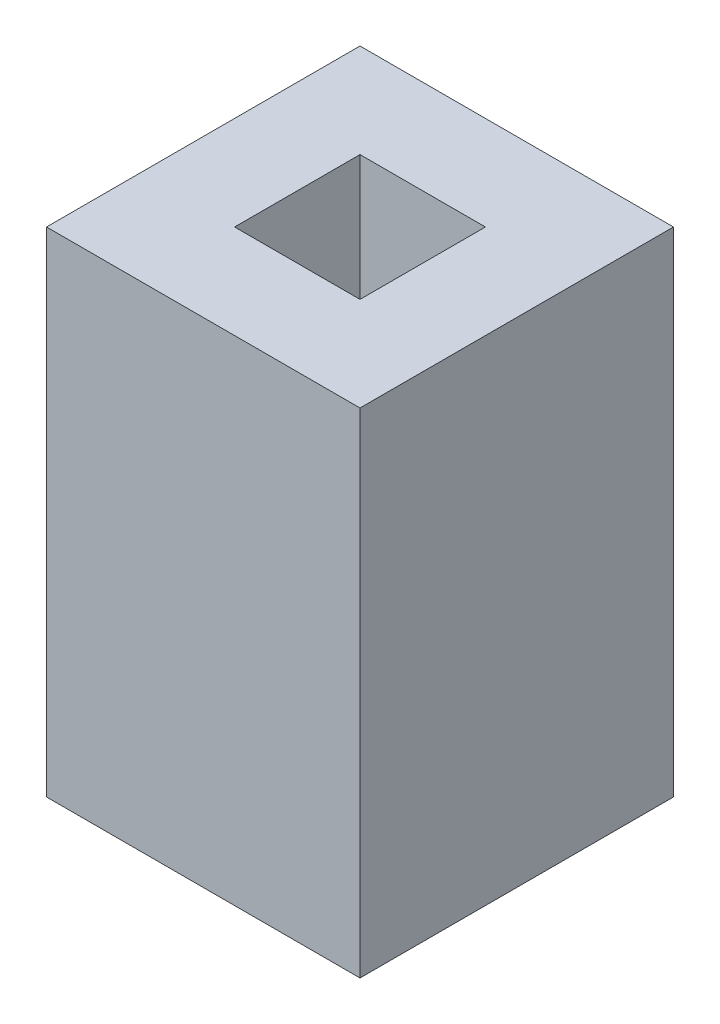
ISO-10303-21;
HEADER;
FILE_DESCRIPTION(('STEP AP214'),'2;1');
FILE_NAME('part.step','',(''),(''),'','','');
FILE_SCHEMA(('AUTOMOTIVE_DESIGN { 1 0 10303 214 1 1 1 1 }'));
ENDSEC;
DATA;
#1=APPLICATION_CONTEXT('core data for automotive mechanical design processes');
#2=APPLICATION_PROTOCOL_DEFINITION('international standard','automotive_design',2000,#1);
#3=PRODUCT_CONTEXT('',#1,'mechanical');
#4=PRODUCT('Part','Part','',(#3));
#5=PRODUCT_RELATED_PRODUCT_CATEGORY('part','',(#4));
#6=PRODUCT_DEFINITION_FORMATION('','',#4);
#7=PRODUCT_DEFINITION_CONTEXT('part definition',#1,'design');
#8=PRODUCT_DEFINITION('design','',#6,#7);
#9=PRODUCT_DEFINITION_SHAPE('','',#8);
#10=(LENGTH_UNIT() NAMED_UNIT(*) SI_UNIT(.MILLI.,.METRE.));
#11=(NAMED_UNIT(*) PLANE_ANGLE_UNIT() SI_UNIT($,.RADIAN.));
#12=(NAMED_UNIT(*) SI_UNIT($,.STERADIAN.) SOLID_ANGLE_UNIT());
#13=UNCERTAINTY_MEASURE_WITH_UNIT(LENGTH_MEASURE(1.E-05),#10,'distance_accuracy_value','');
#14=(GEOMETRIC_REPRESENTATION_CONTEXT(3) GLOBAL_UNCERTAINTY_ASSIGNED_CONTEXT((#13)) GLOBAL_UNIT_ASSIGNED_CONTEXT((#10,
#11,#12)) REPRESENTATION_CONTEXT('',''));
#15=CARTESIAN_POINT('',(0.,0.,0.));
#16=DIRECTION('',(0.,0.,1.));
#17=DIRECTION('',(1.,0.,0.));
#18=AXIS2_PLACEMENT_3D('',#15,#16,#17);
#19=CARTESIAN_POINT('',(-8.38199999999997,2.4,-8.25499999999999));
#20=DIRECTION('',(1.,0.,0.));
#21=DIRECTION('',(0.,0.,-1.));
#22=AXIS2_PLACEMENT_3D('',#19,#20,#21);
#23=PLANE('',#22);
#24=DIRECTION('',(0.,0.,-1.));
#25=VECTOR('',#24,1.);
#26=CARTESIAN_POINT('',(-8.38199999999997,4.4,-8.25499999999999));
#27=LINE('',#26,#25);
#28=CARTESIAN_POINT('',(-8.38199999999997,4.4,-8.25499999999999));
#29=VERTEX_POINT('',#28);
#30=CARTESIAN_POINT('',(-8.38199999999997,4.4,-9.525));
#31=VERTEX_POINT('',#30);
#32=EDGE_CURVE('E11',#29,#31,#27,.T.);
#33=ORIENTED_EDGE('',*,*,#32,.F.);
#34=DIRECTION('',(0.,1.,0.));
#35=VECTOR('',#34,1.);
#36=CARTESIAN_POINT('',(-8.38199999999997,2.4,-8.25499999999999));
#37=LINE('',#36,#35);
#38=CARTESIAN_POINT('',(-8.38199999999997,2.4,-8.25499999999999));
#39=VERTEX_POINT('',#38);
#40=EDGE_CURVE('E24',#39,#29,#37,.T.);
#41=ORIENTED_EDGE('',*,*,#40,.F.);
#42=DIRECTION('',(0.,0.,-1.));
#43=VECTOR('',#42,1.);
#44=CARTESIAN_POINT('',(-8.38199999999997,2.4,-8.25499999999999));
#45=LINE('',#44,#43);
#46=CARTESIAN_POINT('',(-8.38199999999997,2.4,-9.525));
#47=VERTEX_POINT('',#46);
#48=EDGE_CURVE('E144',#39,#47,#45,.T.);
#49=ORIENTED_EDGE('',*,*,#48,.T.);
#50=DIRECTION('',(0.,1.,0.));
#51=VECTOR('',#50,1.);
#52=CARTESIAN_POINT('',(-8.38199999999997,2.4,-9.525));
#53=LINE('',#52,#51);
#54=EDGE_CURVE('E142',#47,#31,#53,.T.);
#55=ORIENTED_EDGE('',*,*,#54,.T.);
#56=EDGE_LOOP('',(#33,#41,#49,#55));
#57=FACE_BOUND('',#56,.T.);
#58=ADVANCED_FACE('F17',(#57),#23,.T.);
#59=CARTESIAN_POINT('',(-9.652,2.4,-8.25499999999999));
#60=DIRECTION('',(0.,0.,1.));
#61=DIRECTION('',(1.,0.,0.));
#62=AXIS2_PLACEMENT_3D('',#59,#60,#61);
#63=PLANE('',#62);
#64=DIRECTION('',(1.,0.,0.));
#65=VECTOR('',#64,1.);
#66=CARTESIAN_POINT('',(-9.652,4.4,-8.25499999999999));
#67=LINE('',#66,#65);
#68=CARTESIAN_POINT('',(-9.652,4.4,-8.25499999999999));
#69=VERTEX_POINT('',#68);
#70=EDGE_CURVE('E140',#69,#29,#67,.T.);
#71=ORIENTED_EDGE('',*,*,#70,.F.);
#72=DIRECTION('',(0.,1.,0.));
#73=VECTOR('',#72,1.);
#74=CARTESIAN_POINT('',(-9.652,2.4,-8.25499999999999));
#75=LINE('',#74,#73);
#76=CARTESIAN_POINT('',(-9.652,2.4,-8.25499999999999));
#77=VERTEX_POINT('',#76);
#78=EDGE_CURVE('E137',#77,#69,#75,.T.);
#79=ORIENTED_EDGE('',*,*,#78,.F.);
#80=DIRECTION('',(1.,0.,0.));
#81=VECTOR('',#80,1.);
#82=CARTESIAN_POINT('',(-9.652,2.4,-8.25499999999999));
#83=LINE('',#82,#81);
#84=EDGE_CURVE('E134',#77,#39,#83,.T.);
#85=ORIENTED_EDGE('',*,*,#84,.T.);
#86=ORIENTED_EDGE('',*,*,#40,.T.);
#87=EDGE_LOOP('',(#71,#79,#85,#86));
#88=FACE_BOUND('',#87,.T.);
#89=ADVANCED_FACE('F146',(#88),#63,.T.);
#90=CARTESIAN_POINT('',(-9.652,2.4,-9.525));
#91=DIRECTION('',(-1.,0.,0.));
#92=DIRECTION('',(0.,0.,1.));
#93=AXIS2_PLACEMENT_3D('',#90,#91,#92);
#94=PLANE('',#93);
#95=DIRECTION('',(0.,0.,1.));
#96=VECTOR('',#95,1.);
#97=CARTESIAN_POINT('',(-9.652,4.4,-9.525));
#98=LINE('',#97,#96);
#99=CARTESIAN_POINT('',(-9.652,4.4,-9.525));
#100=VERTEX_POINT('',#99);
#101=EDGE_CURVE('E131',#100,#69,#98,.T.);
#102=ORIENTED_EDGE('',*,*,#101,.F.);
#103=DIRECTION('',(0.,1.,0.));
#104=VECTOR('',#103,1.);
#105=CARTESIAN_POINT('',(-9.652,2.4,-9.525));
#106=LINE('',#105,#104);
#107=CARTESIAN_POINT('',(-9.652,2.4,-9.525));
#108=VERTEX_POINT('',#107);
#109=EDGE_CURVE('E128',#108,#100,#106,.T.);
#110=ORIENTED_EDGE('',*,*,#109,.F.);
#111=DIRECTION('',(0.,0.,1.));
#112=VECTOR('',#111,1.);
#113=CARTESIAN_POINT('',(-9.652,2.4,-9.525));
#114=LINE('',#113,#112);
#115=EDGE_CURVE('E125',#108,#77,#114,.T.);
#116=ORIENTED_EDGE('',*,*,#115,.T.);
#117=ORIENTED_EDGE('',*,*,#78,.T.);
#118=EDGE_LOOP('',(#102,#110,#116,#117));
#119=FACE_BOUND('',#118,.T.);
#120=ADVANCED_FACE('F151',(#119),#94,.T.);
#121=CARTESIAN_POINT('',(-8.38199999999997,2.4,-9.525));
#122=DIRECTION('',(0.,0.,-1.));
#123=DIRECTION('',(-1.,0.,0.));
#124=AXIS2_PLACEMENT_3D('',#121,#122,#123);
#125=PLANE('',#124);
#126=DIRECTION('',(-1.,0.,0.));
#127=VECTOR('',#126,1.);
#128=CARTESIAN_POINT('',(-8.38199999999997,4.4,-9.525));
#129=LINE('',#128,#127);
#130=EDGE_CURVE('E123',#31,#100,#129,.T.);
#131=ORIENTED_EDGE('',*,*,#130,.F.);
#132=ORIENTED_EDGE('',*,*,#54,.F.);
#133=DIRECTION('',(-1.,0.,0.));
#134=VECTOR('',#133,1.);
#135=CARTESIAN_POINT('',(-8.38199999999997,2.4,-9.525));
#136=LINE('',#135,#134);
#137=EDGE_CURVE('E120',#47,#108,#136,.T.);
#138=ORIENTED_EDGE('',*,*,#137,.T.);
#139=ORIENTED_EDGE('',*,*,#109,.T.);
#140=EDGE_LOOP('',(#131,#132,#138,#139));
#141=FACE_BOUND('',#140,.T.);
#142=ADVANCED_FACE('F154',(#141),#125,.T.);
#143=CARTESIAN_POINT('',(0.,2.4,0.));
#144=DIRECTION('',(0.,1.,0.));
#145=DIRECTION('',(0.,0.,1.));
#146=AXIS2_PLACEMENT_3D('',#143,#144,#145);
#147=PLANE('',#146);
#148=DIRECTION('',(-1.,0.,0.));
#149=VECTOR('',#148,1.);
#150=CARTESIAN_POINT('',(-8.763,2.4,-9.144));
#151=LINE('',#150,#149);
#152=CARTESIAN_POINT('',(-8.763,2.4,-9.144));
#153=VERTEX_POINT('',#152);
#154=CARTESIAN_POINT('',(-9.271,2.4,-9.144));
#155=VERTEX_POINT('',#154);
#156=EDGE_CURVE('E118',#153,#155,#151,.T.);
#157=ORIENTED_EDGE('',*,*,#156,.T.);
#158=DIRECTION('',(0.,0.,1.));
#159=VECTOR('',#158,1.);
#160=CARTESIAN_POINT('',(-9.271,2.4,-9.144));
#161=LINE('',#160,#159);
#162=CARTESIAN_POINT('',(-9.271,2.4,-8.636));
#163=VERTEX_POINT('',#162);
#164=EDGE_CURVE('E116',#155,#163,#161,.T.);
#165=ORIENTED_EDGE('',*,*,#164,.T.);
#166=DIRECTION('',(1.,0.,0.));
#167=VECTOR('',#166,1.);
#168=CARTESIAN_POINT('',(-9.271,2.4,-8.636));
#169=LINE('',#168,#167);
#170=CARTESIAN_POINT('',(-8.763,2.4,-8.636));
#171=VERTEX_POINT('',#170);
#172=EDGE_CURVE('E114',#163,#171,#169,.T.);
#173=ORIENTED_EDGE('',*,*,#172,.T.);
#174=DIRECTION('',(0.,0.,-1.));
#175=VECTOR('',#174,1.);
#176=CARTESIAN_POINT('',(-8.763,2.4,-8.636));
#177=LINE('',#176,#175);
#178=EDGE_CURVE('E101',#171,#153,#177,.T.);
#179=ORIENTED_EDGE('',*,*,#178,.T.);
#180=EDGE_LOOP('',(#157,#165,#173,#179));
#181=FACE_BOUND('',#180,.T.);
#182=ORIENTED_EDGE('',*,*,#48,.F.);
#183=ORIENTED_EDGE('',*,*,#84,.F.);
#184=ORIENTED_EDGE('',*,*,#115,.F.);
#185=ORIENTED_EDGE('',*,*,#137,.F.);
#186=EDGE_LOOP('',(#182,#183,#184,#185));
#187=FACE_BOUND('',#186,.T.);
#188=ADVANCED_FACE('F158',(#181,#187),#147,.F.);
#189=CARTESIAN_POINT('',(0.,4.4,0.));
#190=DIRECTION('',(0.,1.,0.));
#191=DIRECTION('',(0.,0.,1.));
#192=AXIS2_PLACEMENT_3D('',#189,#190,#191);
#193=PLANE('',#192);
#194=DIRECTION('',(0.,0.,1.));
#195=VECTOR('',#194,1.);
#196=CARTESIAN_POINT('',(-9.271,4.4,-9.144));
#197=LINE('',#196,#195);
#198=CARTESIAN_POINT('',(-9.271,4.4,-9.144));
#199=VERTEX_POINT('',#198);
#200=CARTESIAN_POINT('',(-9.271,4.4,-8.636));
#201=VERTEX_POINT('',#200);
#202=EDGE_CURVE('E111',#199,#201,#197,.T.);
#203=ORIENTED_EDGE('',*,*,#202,.F.);
#204=DIRECTION('',(-1.,0.,0.));
#205=VECTOR('',#204,1.);
#206=CARTESIAN_POINT('',(-8.763,4.4,-9.144));
#207=LINE('',#206,#205);
#208=CARTESIAN_POINT('',(-8.763,4.4,-9.144));
#209=VERTEX_POINT('',#208);
#210=EDGE_CURVE('E84',#209,#199,#207,.T.);
#211=ORIENTED_EDGE('',*,*,#210,.F.);
#212=DIRECTION('',(0.,0.,-1.));
#213=VECTOR('',#212,1.);
#214=CARTESIAN_POINT('',(-8.763,4.4,-8.636));
#215=LINE('',#214,#213);
#216=CARTESIAN_POINT('',(-8.763,4.4,-8.636));
#217=VERTEX_POINT('',#216);
#218=EDGE_CURVE('E78',#217,#209,#215,.T.);
#219=ORIENTED_EDGE('',*,*,#218,.F.);
#220=DIRECTION('',(1.,0.,0.));
#221=VECTOR('',#220,1.);
#222=CARTESIAN_POINT('',(-9.271,4.4,-8.636));
#223=LINE('',#222,#221);
#224=EDGE_CURVE('E81',#201,#217,#223,.T.);
#225=ORIENTED_EDGE('',*,*,#224,.F.);
#226=EDGE_LOOP('',(#203,#211,#219,#225));
#227=FACE_BOUND('',#226,.T.);
#228=ORIENTED_EDGE('',*,*,#32,.T.);
#229=ORIENTED_EDGE('',*,*,#130,.T.);
#230=ORIENTED_EDGE('',*,*,#101,.T.);
#231=ORIENTED_EDGE('',*,*,#70,.T.);
#232=EDGE_LOOP('',(#228,#229,#230,#231));
#233=FACE_BOUND('',#232,.T.);
#234=ADVANCED_FACE('F80',(#227,#233),#193,.T.);
#235=CARTESIAN_POINT('',(-9.271,2.4,-9.144));
#236=DIRECTION('',(-1.,0.,0.));
#237=DIRECTION('',(0.,0.,1.));
#238=AXIS2_PLACEMENT_3D('',#235,#236,#237);
#239=PLANE('',#238);
#240=ORIENTED_EDGE('',*,*,#202,.T.);
#241=DIRECTION('',(0.,1.,0.));
#242=VECTOR('',#241,1.);
#243=CARTESIAN_POINT('',(-9.271,2.4,-8.636));
#244=LINE('',#243,#242);
#245=EDGE_CURVE('E96',#163,#201,#244,.T.);
#246=ORIENTED_EDGE('',*,*,#245,.F.);
#247=ORIENTED_EDGE('',*,*,#164,.F.);
#248=DIRECTION('',(0.,1.,0.));
#249=VECTOR('',#248,1.);
#250=CARTESIAN_POINT('',(-9.271,2.4,-9.144));
#251=LINE('',#250,#249);
#252=EDGE_CURVE('E104',#155,#199,#251,.T.);
#253=ORIENTED_EDGE('',*,*,#252,.T.);
#254=EDGE_LOOP('',(#240,#246,#247,#253));
#255=FACE_BOUND('',#254,.T.);
#256=ADVANCED_FACE('F176',(#255),#239,.F.);
#257=CARTESIAN_POINT('',(-8.763,2.4,-9.144));
#258=DIRECTION('',(0.,0.,-1.));
#259=DIRECTION('',(-1.,0.,0.));
#260=AXIS2_PLACEMENT_3D('',#257,#258,#259);
#261=PLANE('',#260);
#262=ORIENTED_EDGE('',*,*,#210,.T.);
#263=ORIENTED_EDGE('',*,*,#252,.F.);
#264=ORIENTED_EDGE('',*,*,#156,.F.);
#265=DIRECTION('',(0.,1.,0.));
#266=VECTOR('',#265,1.);
#267=CARTESIAN_POINT('',(-8.763,2.4,-9.144));
#268=LINE('',#267,#266);
#269=EDGE_CURVE('E102',#153,#209,#268,.T.);
#270=ORIENTED_EDGE('',*,*,#269,.T.);
#271=EDGE_LOOP('',(#262,#263,#264,#270));
#272=FACE_BOUND('',#271,.T.);
#273=ADVANCED_FACE('F179',(#272),#261,.F.);
#274=CARTESIAN_POINT('',(-8.763,2.4,-8.636));
#275=DIRECTION('',(1.,0.,0.));
#276=DIRECTION('',(0.,0.,-1.));
#277=AXIS2_PLACEMENT_3D('',#274,#275,#276);
#278=PLANE('',#277);
#279=ORIENTED_EDGE('',*,*,#218,.T.);
#280=ORIENTED_EDGE('',*,*,#269,.F.);
#281=ORIENTED_EDGE('',*,*,#178,.F.);
#282=DIRECTION('',(0.,1.,0.));
#283=VECTOR('',#282,1.);
#284=CARTESIAN_POINT('',(-8.763,2.4,-8.636));
#285=LINE('',#284,#283);
#286=EDGE_CURVE('E94',#171,#217,#285,.T.);
#287=ORIENTED_EDGE('',*,*,#286,.T.);
#288=EDGE_LOOP('',(#279,#280,#281,#287));
#289=FACE_BOUND('',#288,.T.);
#290=ADVANCED_FACE('F99',(#289),#278,.F.);
#291=CARTESIAN_POINT('',(-9.271,2.4,-8.636));
#292=DIRECTION('',(0.,0.,1.));
#293=DIRECTION('',(1.,0.,0.));
#294=AXIS2_PLACEMENT_3D('',#291,#292,#293);
#295=PLANE('',#294);
#296=ORIENTED_EDGE('',*,*,#224,.T.);
#297=ORIENTED_EDGE('',*,*,#286,.F.);
#298=ORIENTED_EDGE('',*,*,#172,.F.);
#299=ORIENTED_EDGE('',*,*,#245,.T.);
#300=EDGE_LOOP('',(#296,#297,#298,#299));
#301=FACE_BOUND('',#300,.T.);
#302=ADVANCED_FACE('F92',(#301),#295,.F.);
#303=CLOSED_SHELL('',(#58,#89,#120,#142,#188,#234,#256,#273,#290,#302));
#304=MANIFOLD_SOLID_BREP('B1',#303);
#305=ADVANCED_BREP_SHAPE_REPRESENTATION('',(#18,#304),#14);
#306=SHAPE_DEFINITION_REPRESENTATION(#9,#305);
ENDSEC;
END-ISO-10303-21;
